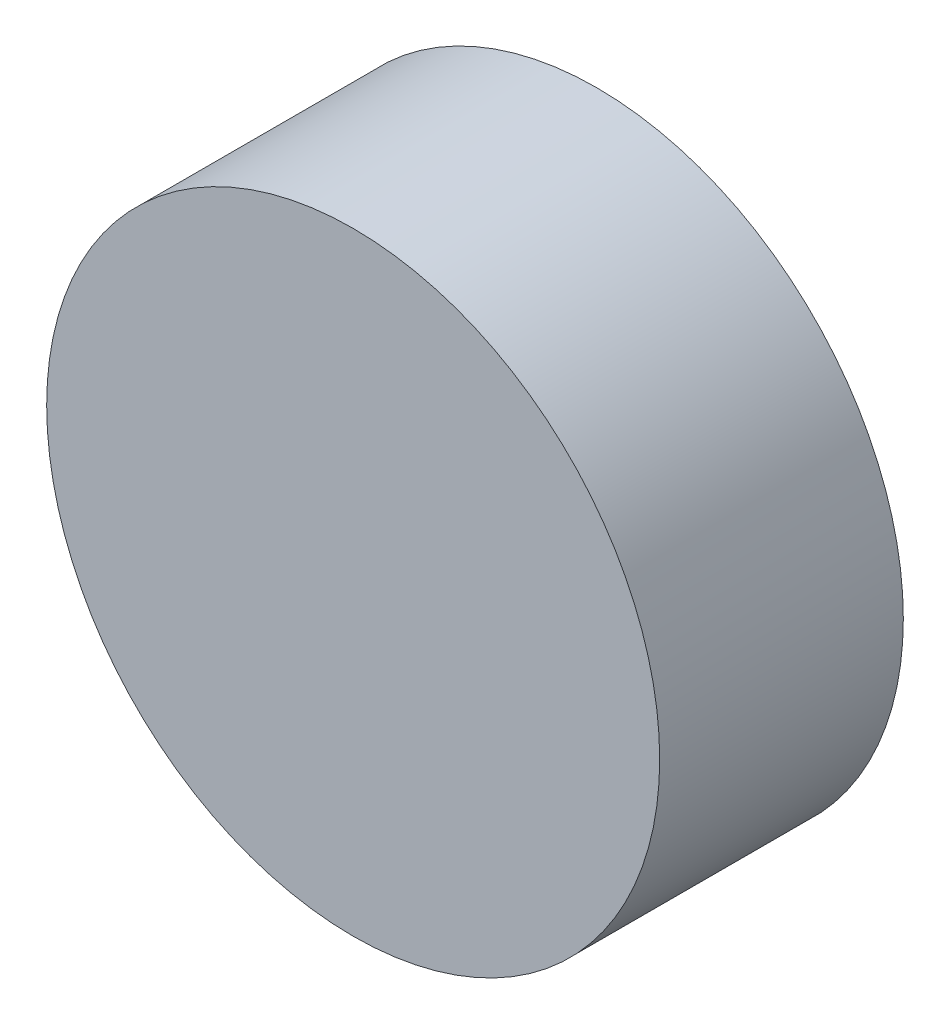
ISO-10303-21;
HEADER;
FILE_DESCRIPTION(('STEP AP214'),'2;1');
FILE_NAME('part.step','',(''),(''),'','','');
FILE_SCHEMA(('AUTOMOTIVE_DESIGN { 1 0 10303 214 1 1 1 1 }'));
ENDSEC;
DATA;
#1=APPLICATION_CONTEXT('core data for automotive mechanical design processes');
#2=APPLICATION_PROTOCOL_DEFINITION('international standard','automotive_design',2000,#1);
#3=PRODUCT_CONTEXT('',#1,'mechanical');
#4=PRODUCT('Part','Part','',(#3));
#5=PRODUCT_RELATED_PRODUCT_CATEGORY('part','',(#4));
#6=PRODUCT_DEFINITION_FORMATION('','',#4);
#7=PRODUCT_DEFINITION_CONTEXT('part definition',#1,'design');
#8=PRODUCT_DEFINITION('design','',#6,#7);
#9=PRODUCT_DEFINITION_SHAPE('','',#8);
#10=(LENGTH_UNIT() NAMED_UNIT(*) SI_UNIT(.MILLI.,.METRE.));
#11=(NAMED_UNIT(*) PLANE_ANGLE_UNIT() SI_UNIT($,.RADIAN.));
#12=(NAMED_UNIT(*) SI_UNIT($,.STERADIAN.) SOLID_ANGLE_UNIT());
#13=UNCERTAINTY_MEASURE_WITH_UNIT(LENGTH_MEASURE(1.E-05),#10,'distance_accuracy_value','');
#14=(GEOMETRIC_REPRESENTATION_CONTEXT(3) GLOBAL_UNCERTAINTY_ASSIGNED_CONTEXT((#13)) GLOBAL_UNIT_ASSIGNED_CONTEXT((#10,
#11,#12)) REPRESENTATION_CONTEXT('',''));
#15=CARTESIAN_POINT('',(0.,0.,0.));
#16=DIRECTION('',(0.,0.,1.));
#17=DIRECTION('',(1.,0.,0.));
#18=AXIS2_PLACEMENT_3D('',#15,#16,#17);
#19=CARTESIAN_POINT('',(0.,0.,23.050246));
#20=DIRECTION('',(0.,0.,-1.));
#21=DIRECTION('',(-1.,0.,0.));
#22=AXIS2_PLACEMENT_3D('',#19,#20,#21);
#23=CYLINDRICAL_SURFACE('',#22,29.);
#24=CARTESIAN_POINT('',(0.,0.,23.050246));
#25=DIRECTION('',(0.,0.,1.));
#26=DIRECTION('',(1.,0.,0.));
#27=AXIS2_PLACEMENT_3D('',#24,#25,#26);
#28=CIRCLE('',#27,29.);
#29=CARTESIAN_POINT('',(29.,0.,23.050246));
#30=VERTEX_POINT('',#29);
#31=EDGE_CURVE('E10',#30,#30,#28,.T.);
#32=ORIENTED_EDGE('',*,*,#31,.F.);
#33=EDGE_LOOP('',(#32));
#34=FACE_BOUND('',#33,.T.);
#35=CARTESIAN_POINT('',(0.,0.,0.));
#36=DIRECTION('',(0.,0.,1.));
#37=DIRECTION('',(1.,0.,0.));
#38=AXIS2_PLACEMENT_3D('',#35,#36,#37);
#39=CIRCLE('',#38,29.);
#40=CARTESIAN_POINT('',(29.,0.,0.));
#41=VERTEX_POINT('',#40);
#42=EDGE_CURVE('E39',#41,#41,#39,.T.);
#43=ORIENTED_EDGE('',*,*,#42,.T.);
#44=EDGE_LOOP('',(#43));
#45=FACE_BOUND('',#44,.T.);
#46=ADVANCED_FACE('F36',(#34,#45),#23,.T.);
#47=CARTESIAN_POINT('',(0.,0.,23.050246));
#48=DIRECTION('',(0.,0.,1.));
#49=DIRECTION('',(1.,0.,0.));
#50=AXIS2_PLACEMENT_3D('',#47,#48,#49);
#51=PLANE('',#50);
#52=ORIENTED_EDGE('',*,*,#31,.T.);
#53=EDGE_LOOP('',(#52));
#54=FACE_BOUND('',#53,.T.);
#55=ADVANCED_FACE('F51',(#54),#51,.T.);
#56=CARTESIAN_POINT('',(0.,0.,0.));
#57=DIRECTION('',(0.,0.,1.));
#58=DIRECTION('',(1.,0.,0.));
#59=AXIS2_PLACEMENT_3D('',#56,#57,#58);
#60=PLANE('',#59);
#61=ORIENTED_EDGE('',*,*,#42,.F.);
#62=EDGE_LOOP('',(#61));
#63=FACE_BOUND('',#62,.T.);
#64=ADVANCED_FACE('F49',(#63),#60,.F.);
#65=CLOSED_SHELL('',(#46,#55,#64));
#66=MANIFOLD_SOLID_BREP('B2',#65);
#67=ADVANCED_BREP_SHAPE_REPRESENTATION('',(#18,#66),#14);
#68=SHAPE_DEFINITION_REPRESENTATION(#9,#67);
ENDSEC;
END-ISO-10303-21;
